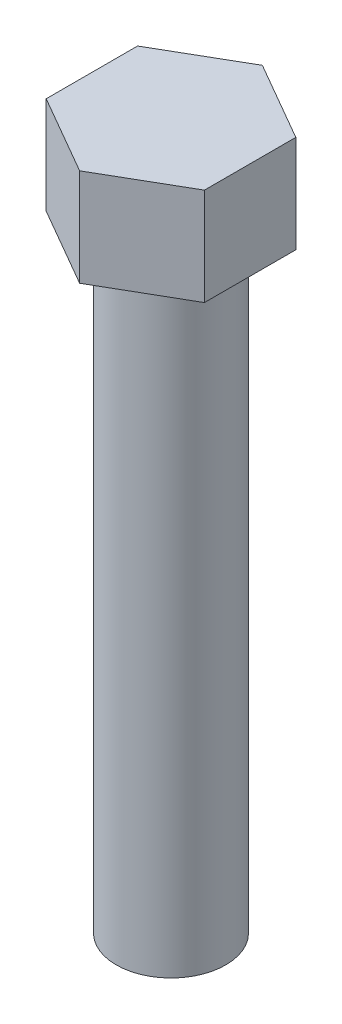
ISO-10303-21;
HEADER;
FILE_DESCRIPTION(('STEP AP214'),'2;1');
FILE_NAME('part.step','',(''),(''),'','','');
FILE_SCHEMA(('AUTOMOTIVE_DESIGN { 1 0 10303 214 1 1 1 1 }'));
ENDSEC;
DATA;
#1=APPLICATION_CONTEXT('core data for automotive mechanical design processes');
#2=APPLICATION_PROTOCOL_DEFINITION('international standard','automotive_design',2000,#1);
#3=PRODUCT_CONTEXT('',#1,'mechanical');
#4=PRODUCT('Part','Part','',(#3));
#5=PRODUCT_RELATED_PRODUCT_CATEGORY('part','',(#4));
#6=PRODUCT_DEFINITION_FORMATION('','',#4);
#7=PRODUCT_DEFINITION_CONTEXT('part definition',#1,'design');
#8=PRODUCT_DEFINITION('design','',#6,#7);
#9=PRODUCT_DEFINITION_SHAPE('','',#8);
#10=(LENGTH_UNIT() NAMED_UNIT(*) SI_UNIT(.MILLI.,.METRE.));
#11=(NAMED_UNIT(*) PLANE_ANGLE_UNIT() SI_UNIT($,.RADIAN.));
#12=(NAMED_UNIT(*) SI_UNIT($,.STERADIAN.) SOLID_ANGLE_UNIT());
#13=UNCERTAINTY_MEASURE_WITH_UNIT(LENGTH_MEASURE(1.E-05),#10,'distance_accuracy_value','');
#14=(GEOMETRIC_REPRESENTATION_CONTEXT(3) GLOBAL_UNCERTAINTY_ASSIGNED_CONTEXT((#13)) GLOBAL_UNIT_ASSIGNED_CONTEXT((#10,
#11,#12)) REPRESENTATION_CONTEXT('',''));
#15=CARTESIAN_POINT('',(0.,0.,0.));
#16=DIRECTION('',(0.,0.,1.));
#17=DIRECTION('',(1.,0.,0.));
#18=AXIS2_PLACEMENT_3D('',#15,#16,#17);
#19=CARTESIAN_POINT('',(0.,25.,0.));
#20=DIRECTION('',(0.,-1.,0.));
#21=DIRECTION('',(0.,0.,-1.));
#22=AXIS2_PLACEMENT_3D('',#19,#20,#21);
#23=CYLINDRICAL_SURFACE('',#22,2.25);
#24=CARTESIAN_POINT('',(0.,25.,0.));
#25=DIRECTION('',(0.,1.,0.));
#26=DIRECTION('',(0.,0.,1.));
#27=AXIS2_PLACEMENT_3D('',#24,#25,#26);
#28=CIRCLE('',#27,2.25);
#29=CARTESIAN_POINT('',(0.,25.,2.25));
#30=VERTEX_POINT('',#29);
#31=EDGE_CURVE('E11',#30,#30,#28,.T.);
#32=ORIENTED_EDGE('',*,*,#31,.F.);
#33=EDGE_LOOP('',(#32));
#34=FACE_BOUND('',#33,.T.);
#35=CARTESIAN_POINT('',(0.,0.,0.));
#36=DIRECTION('',(0.,1.,0.));
#37=DIRECTION('',(0.,0.,1.));
#38=AXIS2_PLACEMENT_3D('',#35,#36,#37);
#39=CIRCLE('',#38,2.25);
#40=CARTESIAN_POINT('',(0.,0.,2.25));
#41=VERTEX_POINT('',#40);
#42=EDGE_CURVE('E48',#41,#41,#39,.T.);
#43=ORIENTED_EDGE('',*,*,#42,.T.);
#44=EDGE_LOOP('',(#43));
#45=FACE_BOUND('',#44,.T.);
#46=ADVANCED_FACE('F45',(#34,#45),#23,.T.);
#47=CARTESIAN_POINT('',(0.,0.,0.));
#48=DIRECTION('',(0.,1.,0.));
#49=DIRECTION('',(0.,0.,1.));
#50=AXIS2_PLACEMENT_3D('',#47,#48,#49);
#51=PLANE('',#50);
#52=ORIENTED_EDGE('',*,*,#42,.F.);
#53=EDGE_LOOP('',(#52));
#54=FACE_BOUND('',#53,.T.);
#55=ADVANCED_FACE('F170',(#54),#51,.F.);
#56=CARTESIAN_POINT('',(0.,29.,3.75277674973257));
#57=DIRECTION('',(-0.5,0.,-0.866025403784439));
#58=DIRECTION('',(-0.866025403784439,0.,0.5));
#59=AXIS2_PLACEMENT_3D('',#56,#57,#58);
#60=PLANE('',#59);
#61=DIRECTION('',(0.866025403784439,0.,-0.5));
#62=VECTOR('',#61,1.);
#63=CARTESIAN_POINT('',(0.,25.,3.75277674973257));
#64=LINE('',#63,#62);
#65=CARTESIAN_POINT('',(0.,25.,3.75277674973257));
#66=VERTEX_POINT('',#65);
#67=CARTESIAN_POINT('',(3.25,25.,1.87638837486629));
#68=VERTEX_POINT('',#67);
#69=EDGE_CURVE('E135',#66,#68,#64,.T.);
#70=ORIENTED_EDGE('',*,*,#69,.T.);
#71=DIRECTION('',(0.,-1.,0.));
#72=VECTOR('',#71,1.);
#73=CARTESIAN_POINT('',(3.25,29.,1.87638837486629));
#74=LINE('',#73,#72);
#75=CARTESIAN_POINT('',(3.25,29.,1.87638837486629));
#76=VERTEX_POINT('',#75);
#77=EDGE_CURVE('E162',#76,#68,#74,.T.);
#78=ORIENTED_EDGE('',*,*,#77,.F.);
#79=DIRECTION('',(0.866025403784439,0.,-0.5));
#80=VECTOR('',#79,1.);
#81=CARTESIAN_POINT('',(0.,29.,3.75277674973257));
#82=LINE('',#81,#80);
#83=CARTESIAN_POINT('',(0.,29.,3.75277674973257));
#84=VERTEX_POINT('',#83);
#85=EDGE_CURVE('E151',#84,#76,#82,.T.);
#86=ORIENTED_EDGE('',*,*,#85,.F.);
#87=DIRECTION('',(0.,-1.,0.));
#88=VECTOR('',#87,1.);
#89=CARTESIAN_POINT('',(0.,29.,3.75277674973257));
#90=LINE('',#89,#88);
#91=EDGE_CURVE('E131',#84,#66,#90,.T.);
#92=ORIENTED_EDGE('',*,*,#91,.T.);
#93=EDGE_LOOP('',(#70,#78,#86,#92));
#94=FACE_BOUND('',#93,.T.);
#95=ADVANCED_FACE('F172',(#94),#60,.F.);
#96=CARTESIAN_POINT('',(3.25,29.,1.87638837486629));
#97=DIRECTION('',(-1.,0.,0.));
#98=DIRECTION('',(0.,0.,1.));
#99=AXIS2_PLACEMENT_3D('',#96,#97,#98);
#100=PLANE('',#99);
#101=DIRECTION('',(0.,0.,-1.));
#102=VECTOR('',#101,1.);
#103=CARTESIAN_POINT('',(3.25,25.,1.87638837486629));
#104=LINE('',#103,#102);
#105=CARTESIAN_POINT('',(3.25,25.,-1.87638837486629));
#106=VERTEX_POINT('',#105);
#107=EDGE_CURVE('E139',#68,#106,#104,.T.);
#108=ORIENTED_EDGE('',*,*,#107,.T.);
#109=DIRECTION('',(0.,-1.,0.));
#110=VECTOR('',#109,1.);
#111=CARTESIAN_POINT('',(3.25,29.,-1.87638837486629));
#112=LINE('',#111,#110);
#113=CARTESIAN_POINT('',(3.25,29.,-1.87638837486629));
#114=VERTEX_POINT('',#113);
#115=EDGE_CURVE('E158',#114,#106,#112,.T.);
#116=ORIENTED_EDGE('',*,*,#115,.F.);
#117=DIRECTION('',(0.,0.,-1.));
#118=VECTOR('',#117,1.);
#119=CARTESIAN_POINT('',(3.25,29.,1.87638837486629));
#120=LINE('',#119,#118);
#121=EDGE_CURVE('E100',#76,#114,#120,.T.);
#122=ORIENTED_EDGE('',*,*,#121,.F.);
#123=ORIENTED_EDGE('',*,*,#77,.T.);
#124=EDGE_LOOP('',(#108,#116,#122,#123));
#125=FACE_BOUND('',#124,.T.);
#126=ADVANCED_FACE('F177',(#125),#100,.F.);
#127=CARTESIAN_POINT('',(3.25,29.,-1.87638837486629));
#128=DIRECTION('',(-0.5,0.,0.866025403784439));
#129=DIRECTION('',(0.866025403784439,0.,0.5));
#130=AXIS2_PLACEMENT_3D('',#127,#128,#129);
#131=PLANE('',#130);
#132=DIRECTION('',(-0.866025403784439,0.,-0.5));
#133=VECTOR('',#132,1.);
#134=CARTESIAN_POINT('',(3.25,25.,-1.87638837486629));
#135=LINE('',#134,#133);
#136=CARTESIAN_POINT('',(0.,25.,-3.75277674973257));
#137=VERTEX_POINT('',#136);
#138=EDGE_CURVE('E142',#106,#137,#135,.T.);
#139=ORIENTED_EDGE('',*,*,#138,.T.);
#140=DIRECTION('',(0.,-1.,0.));
#141=VECTOR('',#140,1.);
#142=CARTESIAN_POINT('',(0.,29.,-3.75277674973257));
#143=LINE('',#142,#141);
#144=CARTESIAN_POINT('',(0.,29.,-3.75277674973257));
#145=VERTEX_POINT('',#144);
#146=EDGE_CURVE('E124',#145,#137,#143,.T.);
#147=ORIENTED_EDGE('',*,*,#146,.F.);
#148=DIRECTION('',(-0.866025403784439,0.,-0.5));
#149=VECTOR('',#148,1.);
#150=CARTESIAN_POINT('',(3.25,29.,-1.87638837486629));
#151=LINE('',#150,#149);
#152=EDGE_CURVE('E113',#114,#145,#151,.T.);
#153=ORIENTED_EDGE('',*,*,#152,.F.);
#154=ORIENTED_EDGE('',*,*,#115,.T.);
#155=EDGE_LOOP('',(#139,#147,#153,#154));
#156=FACE_BOUND('',#155,.T.);
#157=ADVANCED_FACE('F184',(#156),#131,.F.);
#158=CARTESIAN_POINT('',(0.,29.,-3.75277674973257));
#159=DIRECTION('',(0.5,0.,0.866025403784439));
#160=DIRECTION('',(0.866025403784439,0.,-0.5));
#161=AXIS2_PLACEMENT_3D('',#158,#159,#160);
#162=PLANE('',#161);
#163=DIRECTION('',(-0.866025403784439,0.,0.5));
#164=VECTOR('',#163,1.);
#165=CARTESIAN_POINT('',(0.,25.,-3.75277674973257));
#166=LINE('',#165,#164);
#167=CARTESIAN_POINT('',(-3.25,25.,-1.87638837486628));
#168=VERTEX_POINT('',#167);
#169=EDGE_CURVE('E122',#137,#168,#166,.T.);
#170=ORIENTED_EDGE('',*,*,#169,.T.);
#171=DIRECTION('',(0.,-1.,0.));
#172=VECTOR('',#171,1.);
#173=CARTESIAN_POINT('',(-3.25,29.,-1.87638837486628));
#174=LINE('',#173,#172);
#175=CARTESIAN_POINT('',(-3.25,29.,-1.87638837486628));
#176=VERTEX_POINT('',#175);
#177=EDGE_CURVE('E119',#176,#168,#174,.T.);
#178=ORIENTED_EDGE('',*,*,#177,.F.);
#179=DIRECTION('',(-0.866025403784439,0.,0.5));
#180=VECTOR('',#179,1.);
#181=CARTESIAN_POINT('',(0.,29.,-3.75277674973257));
#182=LINE('',#181,#180);
#183=EDGE_CURVE('E107',#145,#176,#182,.T.);
#184=ORIENTED_EDGE('',*,*,#183,.F.);
#185=ORIENTED_EDGE('',*,*,#146,.T.);
#186=EDGE_LOOP('',(#170,#178,#184,#185));
#187=FACE_BOUND('',#186,.T.);
#188=ADVANCED_FACE('F120',(#187),#162,.F.);
#189=CARTESIAN_POINT('',(-3.25,29.,-1.87638837486628));
#190=DIRECTION('',(1.,0.,0.));
#191=DIRECTION('',(0.,0.,-1.));
#192=AXIS2_PLACEMENT_3D('',#189,#190,#191);
#193=PLANE('',#192);
#194=DIRECTION('',(0.,0.,1.));
#195=VECTOR('',#194,1.);
#196=CARTESIAN_POINT('',(-3.25,25.,-1.87638837486628));
#197=LINE('',#196,#195);
#198=CARTESIAN_POINT('',(-3.25,25.,1.87638837486628));
#199=VERTEX_POINT('',#198);
#200=EDGE_CURVE('E85',#168,#199,#197,.T.);
#201=ORIENTED_EDGE('',*,*,#200,.T.);
#202=DIRECTION('',(0.,-1.,0.));
#203=VECTOR('',#202,1.);
#204=CARTESIAN_POINT('',(-3.25,29.,1.87638837486628));
#205=LINE('',#204,#203);
#206=CARTESIAN_POINT('',(-3.25,29.,1.87638837486628));
#207=VERTEX_POINT('',#206);
#208=EDGE_CURVE('E125',#207,#199,#205,.T.);
#209=ORIENTED_EDGE('',*,*,#208,.F.);
#210=DIRECTION('',(0.,0.,1.));
#211=VECTOR('',#210,1.);
#212=CARTESIAN_POINT('',(-3.25,29.,-1.87638837486628));
#213=LINE('',#212,#211);
#214=EDGE_CURVE('E111',#176,#207,#213,.T.);
#215=ORIENTED_EDGE('',*,*,#214,.F.);
#216=ORIENTED_EDGE('',*,*,#177,.T.);
#217=EDGE_LOOP('',(#201,#209,#215,#216));
#218=FACE_BOUND('',#217,.T.);
#219=ADVANCED_FACE('F127',(#218),#193,.F.);
#220=CARTESIAN_POINT('',(-3.25,29.,1.87638837486628));
#221=DIRECTION('',(0.5,0.,-0.866025403784439));
#222=DIRECTION('',(-0.866025403784439,0.,-0.5));
#223=AXIS2_PLACEMENT_3D('',#220,#221,#222);
#224=PLANE('',#223);
#225=DIRECTION('',(0.866025403784439,0.,0.5));
#226=VECTOR('',#225,1.);
#227=CARTESIAN_POINT('',(-3.25,25.,1.87638837486628));
#228=LINE('',#227,#226);
#229=EDGE_CURVE('E91',#199,#66,#228,.T.);
#230=ORIENTED_EDGE('',*,*,#229,.T.);
#231=ORIENTED_EDGE('',*,*,#91,.F.);
#232=DIRECTION('',(0.866025403784439,0.,0.5));
#233=VECTOR('',#232,1.);
#234=CARTESIAN_POINT('',(-3.25,29.,1.87638837486628));
#235=LINE('',#234,#233);
#236=EDGE_CURVE('E62',#207,#84,#235,.T.);
#237=ORIENTED_EDGE('',*,*,#236,.F.);
#238=ORIENTED_EDGE('',*,*,#208,.T.);
#239=EDGE_LOOP('',(#230,#231,#237,#238));
#240=FACE_BOUND('',#239,.T.);
#241=ADVANCED_FACE('F192',(#240),#224,.F.);
#242=CARTESIAN_POINT('',(0.,29.,0.));
#243=DIRECTION('',(0.,1.,0.));
#244=DIRECTION('',(0.,0.,1.));
#245=AXIS2_PLACEMENT_3D('',#242,#243,#244);
#246=PLANE('',#245);
#247=ORIENTED_EDGE('',*,*,#85,.T.);
#248=ORIENTED_EDGE('',*,*,#121,.T.);
#249=ORIENTED_EDGE('',*,*,#152,.T.);
#250=ORIENTED_EDGE('',*,*,#183,.T.);
#251=ORIENTED_EDGE('',*,*,#214,.T.);
#252=ORIENTED_EDGE('',*,*,#236,.T.);
#253=EDGE_LOOP('',(#247,#248,#249,#250,#251,#252));
#254=FACE_BOUND('',#253,.T.);
#255=ADVANCED_FACE('F109',(#254),#246,.T.);
#256=CARTESIAN_POINT('',(0.,25.,0.));
#257=DIRECTION('',(0.,1.,0.));
#258=DIRECTION('',(0.,0.,1.));
#259=AXIS2_PLACEMENT_3D('',#256,#257,#258);
#260=PLANE('',#259);
#261=ORIENTED_EDGE('',*,*,#31,.T.);
#262=EDGE_LOOP('',(#261));
#263=FACE_BOUND('',#262,.T.);
#264=ORIENTED_EDGE('',*,*,#69,.F.);
#265=ORIENTED_EDGE('',*,*,#229,.F.);
#266=ORIENTED_EDGE('',*,*,#200,.F.);
#267=ORIENTED_EDGE('',*,*,#169,.F.);
#268=ORIENTED_EDGE('',*,*,#138,.F.);
#269=ORIENTED_EDGE('',*,*,#107,.F.);
#270=EDGE_LOOP('',(#264,#265,#266,#267,#268,#269));
#271=FACE_BOUND('',#270,.T.);
#272=ADVANCED_FACE('F195',(#263,#271),#260,.F.);
#273=CLOSED_SHELL('',(#46,#55,#95,#126,#157,#188,#219,#241,#255,#272));
#274=MANIFOLD_SOLID_BREP('B2',#273);
#275=ADVANCED_BREP_SHAPE_REPRESENTATION('',(#18,#274),#14);
#276=SHAPE_DEFINITION_REPRESENTATION(#9,#275);
ENDSEC;
END-ISO-10303-21;
